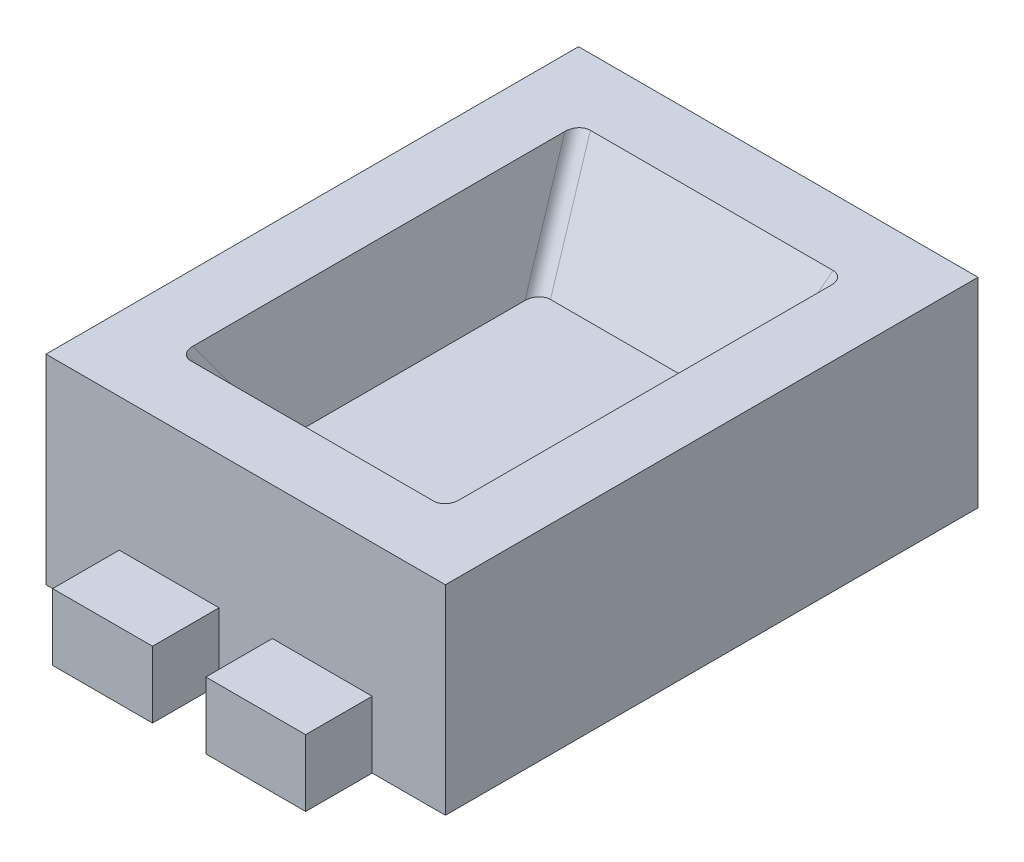
ISO-10303-21;
HEADER;
FILE_DESCRIPTION(('STEP AP214'),'2;1');
FILE_NAME('part.step','',(''),(''),'','','');
FILE_SCHEMA(('AUTOMOTIVE_DESIGN { 1 0 10303 214 1 1 1 1 }'));
ENDSEC;
DATA;
#1=APPLICATION_CONTEXT('core data for automotive mechanical design processes');
#2=APPLICATION_PROTOCOL_DEFINITION('international standard','automotive_design',2000,#1);
#3=PRODUCT_CONTEXT('',#1,'mechanical');
#4=PRODUCT('Part','Part','',(#3));
#5=PRODUCT_RELATED_PRODUCT_CATEGORY('part','',(#4));
#6=PRODUCT_DEFINITION_FORMATION('','',#4);
#7=PRODUCT_DEFINITION_CONTEXT('part definition',#1,'design');
#8=PRODUCT_DEFINITION('design','',#6,#7);
#9=PRODUCT_DEFINITION_SHAPE('','',#8);
#10=(LENGTH_UNIT() NAMED_UNIT(*) SI_UNIT(.MILLI.,.METRE.));
#11=(NAMED_UNIT(*) PLANE_ANGLE_UNIT() SI_UNIT($,.RADIAN.));
#12=(NAMED_UNIT(*) SI_UNIT($,.STERADIAN.) SOLID_ANGLE_UNIT());
#13=UNCERTAINTY_MEASURE_WITH_UNIT(LENGTH_MEASURE(1.E-05),#10,'distance_accuracy_value','');
#14=(GEOMETRIC_REPRESENTATION_CONTEXT(3) GLOBAL_UNCERTAINTY_ASSIGNED_CONTEXT((#13)) GLOBAL_UNIT_ASSIGNED_CONTEXT((#10,
#11,#12)) REPRESENTATION_CONTEXT('',''));
#15=CARTESIAN_POINT('',(0.,0.,0.));
#16=DIRECTION('',(0.,0.,1.));
#17=DIRECTION('',(1.,0.,0.));
#18=AXIS2_PLACEMENT_3D('',#15,#16,#17);
#19=CARTESIAN_POINT('',(1.5,0.,2.));
#20=DIRECTION('',(0.,0.,-1.));
#21=DIRECTION('',(-1.,0.,0.));
#22=AXIS2_PLACEMENT_3D('',#19,#20,#21);
#23=PLANE('',#22);
#24=DIRECTION('',(0.,-1.,0.));
#25=VECTOR('',#24,1.);
#26=CARTESIAN_POINT('',(0.2,0.,2.));
#27=LINE('',#26,#25);
#28=CARTESIAN_POINT('',(0.2,0.5,2.));
#29=VERTEX_POINT('',#28);
#30=CARTESIAN_POINT('',(0.2,0.,2.));
#31=VERTEX_POINT('',#30);
#32=EDGE_CURVE('E347',#29,#31,#27,.T.);
#33=ORIENTED_EDGE('',*,*,#32,.F.);
#34=DIRECTION('',(-1.,0.,0.));
#35=VECTOR('',#34,1.);
#36=CARTESIAN_POINT('',(0.2,0.5,2.));
#37=LINE('',#36,#35);
#38=CARTESIAN_POINT('',(0.95,0.5,2.));
#39=VERTEX_POINT('',#38);
#40=EDGE_CURVE('E340',#39,#29,#37,.T.);
#41=ORIENTED_EDGE('',*,*,#40,.F.);
#42=DIRECTION('',(0.,1.,0.));
#43=VECTOR('',#42,1.);
#44=CARTESIAN_POINT('',(0.95,0.,2.));
#45=LINE('',#44,#43);
#46=CARTESIAN_POINT('',(0.95,0.,2.));
#47=VERTEX_POINT('',#46);
#48=EDGE_CURVE('E343',#47,#39,#45,.T.);
#49=ORIENTED_EDGE('',*,*,#48,.F.);
#50=DIRECTION('',(-1.,0.,0.));
#51=VECTOR('',#50,1.);
#52=CARTESIAN_POINT('',(1.5,0.,2.));
#53=LINE('',#52,#51);
#54=CARTESIAN_POINT('',(1.5,0.,2.));
#55=VERTEX_POINT('',#54);
#56=EDGE_CURVE('E411',#55,#47,#53,.T.);
#57=ORIENTED_EDGE('',*,*,#56,.F.);
#58=DIRECTION('',(0.,-1.,0.));
#59=VECTOR('',#58,1.);
#60=CARTESIAN_POINT('',(1.5,0.,2.));
#61=LINE('',#60,#59);
#62=CARTESIAN_POINT('',(1.5,1.5,2.));
#63=VERTEX_POINT('',#62);
#64=EDGE_CURVE('E420',#63,#55,#61,.T.);
#65=ORIENTED_EDGE('',*,*,#64,.F.);
#66=DIRECTION('',(-1.,0.,0.));
#67=VECTOR('',#66,1.);
#68=CARTESIAN_POINT('',(1.5,1.5,2.));
#69=LINE('',#68,#67);
#70=CARTESIAN_POINT('',(-1.5,1.5,2.));
#71=VERTEX_POINT('',#70);
#72=EDGE_CURVE('E406',#63,#71,#69,.T.);
#73=ORIENTED_EDGE('',*,*,#72,.T.);
#74=DIRECTION('',(0.,-1.,0.));
#75=VECTOR('',#74,1.);
#76=CARTESIAN_POINT('',(-1.5,0.,2.));
#77=LINE('',#76,#75);
#78=CARTESIAN_POINT('',(-1.5,0.,2.));
#79=VERTEX_POINT('',#78);
#80=EDGE_CURVE('E421',#71,#79,#77,.T.);
#81=ORIENTED_EDGE('',*,*,#80,.T.);
#82=CARTESIAN_POINT('',(-0.95,0.,2.));
#83=VERTEX_POINT('',#82);
#84=EDGE_CURVE('E410',#83,#79,#53,.T.);
#85=ORIENTED_EDGE('',*,*,#84,.F.);
#86=DIRECTION('',(0.,-1.,0.));
#87=VECTOR('',#86,1.);
#88=CARTESIAN_POINT('',(-0.95,0.,2.));
#89=LINE('',#88,#87);
#90=CARTESIAN_POINT('',(-0.95,0.5,2.));
#91=VERTEX_POINT('',#90);
#92=EDGE_CURVE('E350',#91,#83,#89,.T.);
#93=ORIENTED_EDGE('',*,*,#92,.F.);
#94=DIRECTION('',(-1.,0.,0.));
#95=VECTOR('',#94,1.);
#96=CARTESIAN_POINT('',(-0.95,0.5,2.));
#97=LINE('',#96,#95);
#98=CARTESIAN_POINT('',(-0.2,0.5,2.));
#99=VERTEX_POINT('',#98);
#100=EDGE_CURVE('E367',#99,#91,#97,.T.);
#101=ORIENTED_EDGE('',*,*,#100,.F.);
#102=DIRECTION('',(0.,1.,0.));
#103=VECTOR('',#102,1.);
#104=CARTESIAN_POINT('',(-0.2,0.,2.));
#105=LINE('',#104,#103);
#106=CARTESIAN_POINT('',(-0.2,0.,2.));
#107=VERTEX_POINT('',#106);
#108=EDGE_CURVE('E380',#107,#99,#105,.T.);
#109=ORIENTED_EDGE('',*,*,#108,.F.);
#110=EDGE_CURVE('E416',#31,#107,#53,.T.);
#111=ORIENTED_EDGE('',*,*,#110,.F.);
#112=EDGE_LOOP('',(#33,#41,#49,#57,#65,#73,#81,#85,#93,#101,#109,#111));
#113=FACE_BOUND('',#112,.T.);
#114=ADVANCED_FACE('F51',(#113),#23,.F.);
#115=CARTESIAN_POINT('',(1.,1.5,1.5));
#116=DIRECTION('',(0.966234939601246,-0.257662650560332,0.));
#117=DIRECTION('',(0.257662650560332,0.966234939601246,0.));
#118=AXIS2_PLACEMENT_3D('',#115,#116,#117);
#119=PLANE('',#118);
#120=DIRECTION('',(0.,0.,-1.));
#121=VECTOR('',#120,1.);
#122=CARTESIAN_POINT('',(0.8,0.75,1.5));
#123=LINE('',#122,#121);
#124=CARTESIAN_POINT('',(0.8,0.75,0.896992467521889));
#125=VERTEX_POINT('',#124);
#126=CARTESIAN_POINT('',(0.8,0.75,-0.896992467521889));
#127=VERTEX_POINT('',#126);
#128=EDGE_CURVE('E461',#125,#127,#123,.T.);
#129=ORIENTED_EDGE('',*,*,#128,.F.);
#130=DIRECTION('',(-0.216612144429553,-0.812295541610823,-0.541530361073883));
#131=VECTOR('',#130,1.);
#132=CARTESIAN_POINT('',(1.0120829950121,1.54531123129536,1.42719995505213));
#133=LINE('',#132,#131);
#134=CARTESIAN_POINT('',(1.,1.5,1.39699246752189));
#135=VERTEX_POINT('',#134);
#136=EDGE_CURVE('E505',#125,#135,#133,.F.);
#137=ORIENTED_EDGE('',*,*,#136,.T.);
#138=DIRECTION('',(0.,0.,-1.));
#139=VECTOR('',#138,1.);
#140=CARTESIAN_POINT('',(1.,1.5,1.5));
#141=LINE('',#140,#139);
#142=CARTESIAN_POINT('',(1.,1.5,-1.39699246752189));
#143=VERTEX_POINT('',#142);
#144=EDGE_CURVE('E465',#135,#143,#141,.T.);
#145=ORIENTED_EDGE('',*,*,#144,.T.);
#146=DIRECTION('',(0.216612144429553,0.812295541610823,-0.541530361073883));
#147=VECTOR('',#146,1.);
#148=CARTESIAN_POINT('',(0.812082995012095,0.795311231295357,-0.927199955052127));
#149=LINE('',#148,#147);
#150=EDGE_CURVE('E502',#143,#127,#149,.F.);
#151=ORIENTED_EDGE('',*,*,#150,.T.);
#152=EDGE_LOOP('',(#129,#137,#145,#151));
#153=FACE_BOUND('',#152,.T.);
#154=ADVANCED_FACE('F563',(#153),#119,.F.);
#155=CARTESIAN_POINT('',(0.8,0.75,1.5));
#156=DIRECTION('',(0.,-1.,0.));
#157=DIRECTION('',(0.,0.,-1.));
#158=AXIS2_PLACEMENT_3D('',#155,#156,#157);
#159=PLANE('',#158);
#160=DIRECTION('',(-1.,0.,0.));
#161=VECTOR('',#160,1.);
#162=CARTESIAN_POINT('',(1.5,0.75,1.));
#163=LINE('',#162,#161);
#164=CARTESIAN_POINT('',(0.711297507257606,0.75,1.));
#165=VERTEX_POINT('',#164);
#166=CARTESIAN_POINT('',(-0.711297507257606,0.75,1.));
#167=VERTEX_POINT('',#166);
#168=EDGE_CURVE('E415',#165,#167,#163,.T.);
#169=ORIENTED_EDGE('',*,*,#168,.F.);
#170=CARTESIAN_POINT('',(0.696505502024933,0.75,0.879814957484533));
#171=DIRECTION('',(0.,-1.,0.));
#172=DIRECTION('',(0.371390676354103,0.,0.92847669088526));
#173=AXIS2_PLACEMENT_3D('',#170,#171,#172);
#174=ELLIPSE('',#173,0.123107902084129,0.1);
#175=EDGE_CURVE('E499',#165,#125,#174,.F.);
#176=ORIENTED_EDGE('',*,*,#175,.T.);
#177=ORIENTED_EDGE('',*,*,#128,.T.);
#178=CARTESIAN_POINT('',(0.696505502024933,0.75,-0.879814957484533));
#179=DIRECTION('',(0.,-1.,0.));
#180=DIRECTION('',(-0.371390676354103,0.,0.92847669088526));
#181=AXIS2_PLACEMENT_3D('',#178,#179,#180);
#182=ELLIPSE('',#181,0.123107902084129,0.1);
#183=CARTESIAN_POINT('',(0.711297507257606,0.75,-1.));
#184=VERTEX_POINT('',#183);
#185=EDGE_CURVE('E496',#127,#184,#182,.F.);
#186=ORIENTED_EDGE('',*,*,#185,.T.);
#187=DIRECTION('',(-1.,0.,0.));
#188=VECTOR('',#187,1.);
#189=CARTESIAN_POINT('',(1.5,0.75,-1.));
#190=LINE('',#189,#188);
#191=CARTESIAN_POINT('',(-0.711297507257606,0.75,-1.));
#192=VERTEX_POINT('',#191);
#193=EDGE_CURVE('E433',#184,#192,#190,.T.);
#194=ORIENTED_EDGE('',*,*,#193,.T.);
#195=CARTESIAN_POINT('',(-0.696505502024933,0.75,-0.879814957484533));
#196=DIRECTION('',(0.,-1.,0.));
#197=DIRECTION('',(-0.371390676354103,0.,-0.92847669088526));
#198=AXIS2_PLACEMENT_3D('',#195,#196,#197);
#199=ELLIPSE('',#198,0.123107902084129,0.1);
#200=CARTESIAN_POINT('',(-0.8,0.75,-0.896992467521889));
#201=VERTEX_POINT('',#200);
#202=EDGE_CURVE('E493',#192,#201,#199,.F.);
#203=ORIENTED_EDGE('',*,*,#202,.T.);
#204=DIRECTION('',(0.,0.,-1.));
#205=VECTOR('',#204,1.);
#206=CARTESIAN_POINT('',(-0.8,0.75,1.5));
#207=LINE('',#206,#205);
#208=CARTESIAN_POINT('',(-0.8,0.75,0.896992467521889));
#209=VERTEX_POINT('',#208);
#210=EDGE_CURVE('E457',#209,#201,#207,.T.);
#211=ORIENTED_EDGE('',*,*,#210,.F.);
#212=CARTESIAN_POINT('',(-0.696505502024933,0.75,0.879814957484533));
#213=DIRECTION('',(0.,-1.,0.));
#214=DIRECTION('',(0.371390676354103,0.,-0.92847669088526));
#215=AXIS2_PLACEMENT_3D('',#212,#213,#214);
#216=ELLIPSE('',#215,0.123107902084129,0.1);
#217=EDGE_CURVE('E490',#209,#167,#216,.F.);
#218=ORIENTED_EDGE('',*,*,#217,.T.);
#219=EDGE_LOOP('',(#169,#176,#177,#186,#194,#203,#211,#218));
#220=FACE_BOUND('',#219,.T.);
#221=ADVANCED_FACE('F545',(#220),#159,.F.);
#222=CARTESIAN_POINT('',(-1.,1.5,1.5));
#223=DIRECTION('',(-0.966234939601246,-0.257662650560332,0.));
#224=DIRECTION('',(0.257662650560332,-0.966234939601246,0.));
#225=AXIS2_PLACEMENT_3D('',#222,#223,#224);
#226=PLANE('',#225);
#227=ORIENTED_EDGE('',*,*,#210,.T.);
#228=DIRECTION('',(0.216612144429553,-0.812295541610823,0.541530361073883));
#229=VECTOR('',#228,1.);
#230=CARTESIAN_POINT('',(-1.0120829950121,1.54531123129536,-1.42719995505213));
#231=LINE('',#230,#229);
#232=CARTESIAN_POINT('',(-1.,1.5,-1.39699246752189));
#233=VERTEX_POINT('',#232);
#234=EDGE_CURVE('E519',#201,#233,#231,.F.);
#235=ORIENTED_EDGE('',*,*,#234,.T.);
#236=DIRECTION('',(0.,0.,-1.));
#237=VECTOR('',#236,1.);
#238=CARTESIAN_POINT('',(-1.,1.5,1.5));
#239=LINE('',#238,#237);
#240=CARTESIAN_POINT('',(-1.,1.5,1.39699246752189));
#241=VERTEX_POINT('',#240);
#242=EDGE_CURVE('E452',#241,#233,#239,.T.);
#243=ORIENTED_EDGE('',*,*,#242,.F.);
#244=DIRECTION('',(-0.216612144429553,0.812295541610823,0.541530361073883));
#245=VECTOR('',#244,1.);
#246=CARTESIAN_POINT('',(-0.812082995012095,0.795311231295357,0.927199955052127));
#247=LINE('',#246,#245);
#248=EDGE_CURVE('E516',#241,#209,#247,.F.);
#249=ORIENTED_EDGE('',*,*,#248,.T.);
#250=EDGE_LOOP('',(#227,#235,#243,#249));
#251=FACE_BOUND('',#250,.T.);
#252=ADVANCED_FACE('F548',(#251),#226,.F.);
#253=CARTESIAN_POINT('',(-1.5,0.,1.5));
#254=DIRECTION('',(1.,0.,0.));
#255=DIRECTION('',(0.,0.,-1.));
#256=AXIS2_PLACEMENT_3D('',#253,#254,#255);
#257=PLANE('',#256);
#258=DIRECTION('',(0.,0.,-1.));
#259=VECTOR('',#258,1.);
#260=CARTESIAN_POINT('',(-1.5,0.,1.5));
#261=LINE('',#260,#259);
#262=CARTESIAN_POINT('',(-1.5,0.,-2.));
#263=VERTEX_POINT('',#262);
#264=EDGE_CURVE('E475',#79,#263,#261,.T.);
#265=ORIENTED_EDGE('',*,*,#264,.F.);
#266=ORIENTED_EDGE('',*,*,#80,.F.);
#267=DIRECTION('',(0.,0.,-1.));
#268=VECTOR('',#267,1.);
#269=CARTESIAN_POINT('',(-1.5,1.5,1.5));
#270=LINE('',#269,#268);
#271=CARTESIAN_POINT('',(-1.5,1.5,-2.));
#272=VERTEX_POINT('',#271);
#273=EDGE_CURVE('E479',#71,#272,#270,.T.);
#274=ORIENTED_EDGE('',*,*,#273,.T.);
#275=DIRECTION('',(0.,1.,0.));
#276=VECTOR('',#275,1.);
#277=CARTESIAN_POINT('',(-1.5,0.,-2.));
#278=LINE('',#277,#276);
#279=EDGE_CURVE('E425',#263,#272,#278,.T.);
#280=ORIENTED_EDGE('',*,*,#279,.F.);
#281=EDGE_LOOP('',(#265,#266,#274,#280));
#282=FACE_BOUND('',#281,.T.);
#283=ADVANCED_FACE('F592',(#282),#257,.F.);
#284=CARTESIAN_POINT('',(-1.5,0.,1.5));
#285=DIRECTION('',(0.,1.,0.));
#286=DIRECTION('',(0.,0.,1.));
#287=AXIS2_PLACEMENT_3D('',#284,#285,#286);
#288=PLANE('',#287);
#289=ORIENTED_EDGE('',*,*,#264,.T.);
#290=DIRECTION('',(-1.,0.,0.));
#291=VECTOR('',#290,1.);
#292=CARTESIAN_POINT('',(1.5,0.,-2.));
#293=LINE('',#292,#291);
#294=CARTESIAN_POINT('',(-0.95,0.,-2.));
#295=VERTEX_POINT('',#294);
#296=EDGE_CURVE('E448',#295,#263,#293,.T.);
#297=ORIENTED_EDGE('',*,*,#296,.F.);
#298=DIRECTION('',(0.,0.,1.));
#299=VECTOR('',#298,1.);
#300=CARTESIAN_POINT('',(-0.95,0.,-2.5));
#301=LINE('',#300,#299);
#302=CARTESIAN_POINT('',(-0.95,0.,-2.5));
#303=VERTEX_POINT('',#302);
#304=EDGE_CURVE('E300',#303,#295,#301,.T.);
#305=ORIENTED_EDGE('',*,*,#304,.F.);
#306=DIRECTION('',(1.,0.,0.));
#307=VECTOR('',#306,1.);
#308=CARTESIAN_POINT('',(-0.95,0.,-2.5));
#309=LINE('',#308,#307);
#310=CARTESIAN_POINT('',(-0.2,0.,-2.5));
#311=VERTEX_POINT('',#310);
#312=EDGE_CURVE('E296',#303,#311,#309,.T.);
#313=ORIENTED_EDGE('',*,*,#312,.T.);
#314=DIRECTION('',(0.,0.,1.));
#315=VECTOR('',#314,1.);
#316=CARTESIAN_POINT('',(-0.2,0.,-2.5));
#317=LINE('',#316,#315);
#318=CARTESIAN_POINT('',(-0.2,0.,-2.));
#319=VERTEX_POINT('',#318);
#320=EDGE_CURVE('E313',#311,#319,#317,.T.);
#321=ORIENTED_EDGE('',*,*,#320,.T.);
#322=CARTESIAN_POINT('',(0.2,0.,-2.));
#323=VERTEX_POINT('',#322);
#324=EDGE_CURVE('E453',#323,#319,#293,.T.);
#325=ORIENTED_EDGE('',*,*,#324,.F.);
#326=DIRECTION('',(0.,0.,1.));
#327=VECTOR('',#326,1.);
#328=CARTESIAN_POINT('',(0.2,0.,-2.5));
#329=LINE('',#328,#327);
#330=CARTESIAN_POINT('',(0.2,0.,-2.5));
#331=VERTEX_POINT('',#330);
#332=EDGE_CURVE('E268',#331,#323,#329,.T.);
#333=ORIENTED_EDGE('',*,*,#332,.F.);
#334=DIRECTION('',(1.,0.,0.));
#335=VECTOR('',#334,1.);
#336=CARTESIAN_POINT('',(0.2,0.,-2.5));
#337=LINE('',#336,#335);
#338=CARTESIAN_POINT('',(0.95,0.,-2.5));
#339=VERTEX_POINT('',#338);
#340=EDGE_CURVE('E256',#331,#339,#337,.T.);
#341=ORIENTED_EDGE('',*,*,#340,.T.);
#342=DIRECTION('',(0.,0.,1.));
#343=VECTOR('',#342,1.);
#344=CARTESIAN_POINT('',(0.95,0.,-2.5));
#345=LINE('',#344,#343);
#346=CARTESIAN_POINT('',(0.95,0.,-2.));
#347=VERTEX_POINT('',#346);
#348=EDGE_CURVE('E277',#339,#347,#345,.T.);
#349=ORIENTED_EDGE('',*,*,#348,.T.);
#350=CARTESIAN_POINT('',(1.5,0.,-2.));
#351=VERTEX_POINT('',#350);
#352=EDGE_CURVE('E449',#351,#347,#293,.T.);
#353=ORIENTED_EDGE('',*,*,#352,.F.);
#354=DIRECTION('',(0.,0.,-1.));
#355=VECTOR('',#354,1.);
#356=CARTESIAN_POINT('',(1.5,0.,1.5));
#357=LINE('',#356,#355);
#358=EDGE_CURVE('E472',#55,#351,#357,.T.);
#359=ORIENTED_EDGE('',*,*,#358,.F.);
#360=ORIENTED_EDGE('',*,*,#56,.T.);
#361=DIRECTION('',(0.,0.,-1.));
#362=VECTOR('',#361,1.);
#363=CARTESIAN_POINT('',(0.95,0.,2.5));
#364=LINE('',#363,#362);
#365=CARTESIAN_POINT('',(0.95,0.,2.5));
#366=VERTEX_POINT('',#365);
#367=EDGE_CURVE('E328',#366,#47,#364,.T.);
#368=ORIENTED_EDGE('',*,*,#367,.F.);
#369=DIRECTION('',(1.,0.,0.));
#370=VECTOR('',#369,1.);
#371=CARTESIAN_POINT('',(0.2,0.,2.5));
#372=LINE('',#371,#370);
#373=CARTESIAN_POINT('',(0.2,0.,2.5));
#374=VERTEX_POINT('',#373);
#375=EDGE_CURVE('E356',#374,#366,#372,.T.);
#376=ORIENTED_EDGE('',*,*,#375,.F.);
#377=DIRECTION('',(0.,0.,-1.));
#378=VECTOR('',#377,1.);
#379=CARTESIAN_POINT('',(0.2,0.,2.5));
#380=LINE('',#379,#378);
#381=EDGE_CURVE('E324',#374,#31,#380,.T.);
#382=ORIENTED_EDGE('',*,*,#381,.T.);
#383=ORIENTED_EDGE('',*,*,#110,.T.);
#384=DIRECTION('',(0.,0.,-1.));
#385=VECTOR('',#384,1.);
#386=CARTESIAN_POINT('',(-0.2,0.,2.5));
#387=LINE('',#386,#385);
#388=CARTESIAN_POINT('',(-0.2,0.,2.5));
#389=VERTEX_POINT('',#388);
#390=EDGE_CURVE('E394',#389,#107,#387,.T.);
#391=ORIENTED_EDGE('',*,*,#390,.F.);
#392=DIRECTION('',(1.,0.,0.));
#393=VECTOR('',#392,1.);
#394=CARTESIAN_POINT('',(-0.95,0.,2.5));
#395=LINE('',#394,#393);
#396=CARTESIAN_POINT('',(-0.95,0.,2.5));
#397=VERTEX_POINT('',#396);
#398=EDGE_CURVE('E366',#397,#389,#395,.T.);
#399=ORIENTED_EDGE('',*,*,#398,.F.);
#400=DIRECTION('',(0.,0.,-1.));
#401=VECTOR('',#400,1.);
#402=CARTESIAN_POINT('',(-0.95,0.,2.5));
#403=LINE('',#402,#401);
#404=EDGE_CURVE('E398',#397,#83,#403,.T.);
#405=ORIENTED_EDGE('',*,*,#404,.T.);
#406=ORIENTED_EDGE('',*,*,#84,.T.);
#407=EDGE_LOOP('',(#289,#297,#305,#313,#321,#325,#333,#341,#349,#353,#359,#360,#368,#376,#382,
#383,#391,#399,#405,#406));
#408=FACE_BOUND('',#407,.T.);
#409=ADVANCED_FACE('F601',(#408),#288,.F.);
#410=CARTESIAN_POINT('',(1.5,0.,1.5));
#411=DIRECTION('',(-1.,0.,0.));
#412=DIRECTION('',(0.,0.,1.));
#413=AXIS2_PLACEMENT_3D('',#410,#411,#412);
#414=PLANE('',#413);
#415=DIRECTION('',(0.,0.,-1.));
#416=VECTOR('',#415,1.);
#417=CARTESIAN_POINT('',(1.5,1.5,1.5));
#418=LINE('',#417,#416);
#419=CARTESIAN_POINT('',(1.5,1.5,-2.));
#420=VERTEX_POINT('',#419);
#421=EDGE_CURVE('E469',#63,#420,#418,.T.);
#422=ORIENTED_EDGE('',*,*,#421,.F.);
#423=ORIENTED_EDGE('',*,*,#64,.T.);
#424=ORIENTED_EDGE('',*,*,#358,.T.);
#425=DIRECTION('',(0.,1.,0.));
#426=VECTOR('',#425,1.);
#427=CARTESIAN_POINT('',(1.5,0.,-2.));
#428=LINE('',#427,#426);
#429=EDGE_CURVE('E429',#351,#420,#428,.T.);
#430=ORIENTED_EDGE('',*,*,#429,.T.);
#431=EDGE_LOOP('',(#422,#423,#424,#430));
#432=FACE_BOUND('',#431,.T.);
#433=ADVANCED_FACE('F597',(#432),#414,.F.);
#434=CARTESIAN_POINT('',(1.5,1.5,1.5));
#435=DIRECTION('',(0.,-1.,0.));
#436=DIRECTION('',(0.,0.,-1.));
#437=AXIS2_PLACEMENT_3D('',#434,#435,#436);
#438=PLANE('',#437);
#439=ORIENTED_EDGE('',*,*,#273,.F.);
#440=ORIENTED_EDGE('',*,*,#72,.F.);
#441=ORIENTED_EDGE('',*,*,#421,.T.);
#442=DIRECTION('',(-1.,0.,0.));
#443=VECTOR('',#442,1.);
#444=CARTESIAN_POINT('',(1.5,1.5,-2.));
#445=LINE('',#444,#443);
#446=EDGE_CURVE('E444',#420,#272,#445,.T.);
#447=ORIENTED_EDGE('',*,*,#446,.T.);
#448=EDGE_LOOP('',(#439,#440,#441,#447));
#449=FACE_BOUND('',#448,.T.);
#450=ORIENTED_EDGE('',*,*,#144,.F.);
#451=CARTESIAN_POINT('',(0.896505502024933,1.5,1.37981495748453));
#452=DIRECTION('',(0.,-1.,0.));
#453=DIRECTION('',(0.371390676354103,0.,0.92847669088526));
#454=AXIS2_PLACEMENT_3D('',#451,#452,#453);
#455=ELLIPSE('',#454,0.123107902084129,0.1);
#456=CARTESIAN_POINT('',(0.911297507257606,1.5,1.5));
#457=VERTEX_POINT('',#456);
#458=EDGE_CURVE('E522',#135,#457,#455,.T.);
#459=ORIENTED_EDGE('',*,*,#458,.T.);
#460=DIRECTION('',(-1.,0.,0.));
#461=VECTOR('',#460,1.);
#462=CARTESIAN_POINT('',(1.5,1.5,1.5));
#463=LINE('',#462,#461);
#464=CARTESIAN_POINT('',(-0.911297507257606,1.5,1.5));
#465=VERTEX_POINT('',#464);
#466=EDGE_CURVE('E402',#457,#465,#463,.T.);
#467=ORIENTED_EDGE('',*,*,#466,.T.);
#468=CARTESIAN_POINT('',(-0.896505502024933,1.5,1.37981495748453));
#469=DIRECTION('',(0.,-1.,0.));
#470=DIRECTION('',(0.371390676354103,0.,-0.92847669088526));
#471=AXIS2_PLACEMENT_3D('',#468,#469,#470);
#472=ELLIPSE('',#471,0.123107902084129,0.1);
#473=EDGE_CURVE('E11',#465,#241,#472,.T.);
#474=ORIENTED_EDGE('',*,*,#473,.T.);
#475=ORIENTED_EDGE('',*,*,#242,.T.);
#476=CARTESIAN_POINT('',(-0.896505502024933,1.5,-1.37981495748453));
#477=DIRECTION('',(0.,-1.,0.));
#478=DIRECTION('',(-0.371390676354103,0.,-0.92847669088526));
#479=AXIS2_PLACEMENT_3D('',#476,#477,#478);
#480=ELLIPSE('',#479,0.123107902084129,0.1);
#481=CARTESIAN_POINT('',(-0.911297507257606,1.5,-1.5));
#482=VERTEX_POINT('',#481);
#483=EDGE_CURVE('E60',#233,#482,#480,.T.);
#484=ORIENTED_EDGE('',*,*,#483,.T.);
#485=DIRECTION('',(-1.,0.,0.));
#486=VECTOR('',#485,1.);
#487=CARTESIAN_POINT('',(1.5,1.5,-1.5));
#488=LINE('',#487,#486);
#489=CARTESIAN_POINT('',(0.911297507257606,1.5,-1.5));
#490=VERTEX_POINT('',#489);
#491=EDGE_CURVE('E440',#490,#482,#488,.T.);
#492=ORIENTED_EDGE('',*,*,#491,.F.);
#493=CARTESIAN_POINT('',(0.896505502024933,1.5,-1.37981495748453));
#494=DIRECTION('',(0.,-1.,0.));
#495=DIRECTION('',(-0.371390676354103,0.,0.92847669088526));
#496=AXIS2_PLACEMENT_3D('',#493,#494,#495);
#497=ELLIPSE('',#496,0.123107902084129,0.1);
#498=EDGE_CURVE('E525',#490,#143,#497,.T.);
#499=ORIENTED_EDGE('',*,*,#498,.T.);
#500=EDGE_LOOP('',(#450,#459,#467,#474,#475,#484,#492,#499));
#501=FACE_BOUND('',#500,.T.);
#502=ADVANCED_FACE('F532',(#449,#501),#438,.F.);
#503=CARTESIAN_POINT('',(1.5,1.5,-1.5));
#504=DIRECTION('',(0.,-0.554700196225229,-0.832050294337844));
#505=DIRECTION('',(0.,0.832050294337843,-0.554700196225229));
#506=AXIS2_PLACEMENT_3D('',#503,#504,#505);
#507=PLANE('',#506);
#508=ORIENTED_EDGE('',*,*,#193,.F.);
#509=DIRECTION('',(0.216612144429553,0.812295541610823,-0.541530361073883));
#510=VECTOR('',#509,1.);
#511=CARTESIAN_POINT('',(0.91545950105197,1.51560747672887,-1.51040498448591));
#512=LINE('',#511,#510);
#513=EDGE_CURVE('E512',#184,#490,#512,.T.);
#514=ORIENTED_EDGE('',*,*,#513,.T.);
#515=ORIENTED_EDGE('',*,*,#491,.T.);
#516=DIRECTION('',(0.216612144429553,-0.812295541610823,0.541530361073883));
#517=VECTOR('',#516,1.);
#518=CARTESIAN_POINT('',(-0.715459501051971,0.765607476728868,-1.01040498448591));
#519=LINE('',#518,#517);
#520=EDGE_CURVE('E508',#482,#192,#519,.T.);
#521=ORIENTED_EDGE('',*,*,#520,.T.);
#522=EDGE_LOOP('',(#508,#514,#515,#521));
#523=FACE_BOUND('',#522,.T.);
#524=ADVANCED_FACE('F539',(#523),#507,.F.);
#525=CARTESIAN_POINT('',(1.5,0.,-2.));
#526=DIRECTION('',(0.,0.,1.));
#527=DIRECTION('',(1.,0.,0.));
#528=AXIS2_PLACEMENT_3D('',#525,#526,#527);
#529=PLANE('',#528);
#530=DIRECTION('',(-1.,0.,0.));
#531=VECTOR('',#530,1.);
#532=CARTESIAN_POINT('',(0.2,0.5,-2.));
#533=LINE('',#532,#531);
#534=CARTESIAN_POINT('',(0.95,0.5,-2.));
#535=VERTEX_POINT('',#534);
#536=CARTESIAN_POINT('',(0.2,0.5,-2.));
#537=VERTEX_POINT('',#536);
#538=EDGE_CURVE('E67',#535,#537,#533,.T.);
#539=ORIENTED_EDGE('',*,*,#538,.T.);
#540=DIRECTION('',(0.,-1.,0.));
#541=VECTOR('',#540,1.);
#542=CARTESIAN_POINT('',(0.2,0.,-2.));
#543=LINE('',#542,#541);
#544=EDGE_CURVE('E242',#537,#323,#543,.T.);
#545=ORIENTED_EDGE('',*,*,#544,.T.);
#546=ORIENTED_EDGE('',*,*,#324,.T.);
#547=DIRECTION('',(0.,1.,0.));
#548=VECTOR('',#547,1.);
#549=CARTESIAN_POINT('',(-0.2,0.,-2.));
#550=LINE('',#549,#548);
#551=CARTESIAN_POINT('',(-0.2,0.5,-2.));
#552=VERTEX_POINT('',#551);
#553=EDGE_CURVE('E288',#319,#552,#550,.T.);
#554=ORIENTED_EDGE('',*,*,#553,.T.);
#555=DIRECTION('',(-1.,0.,0.));
#556=VECTOR('',#555,1.);
#557=CARTESIAN_POINT('',(-0.95,0.5,-2.));
#558=LINE('',#557,#556);
#559=CARTESIAN_POINT('',(-0.95,0.5,-2.));
#560=VERTEX_POINT('',#559);
#561=EDGE_CURVE('E304',#552,#560,#558,.T.);
#562=ORIENTED_EDGE('',*,*,#561,.T.);
#563=DIRECTION('',(0.,-1.,0.));
#564=VECTOR('',#563,1.);
#565=CARTESIAN_POINT('',(-0.95,0.,-2.));
#566=LINE('',#565,#564);
#567=EDGE_CURVE('E246',#560,#295,#566,.T.);
#568=ORIENTED_EDGE('',*,*,#567,.T.);
#569=ORIENTED_EDGE('',*,*,#296,.T.);
#570=ORIENTED_EDGE('',*,*,#279,.T.);
#571=ORIENTED_EDGE('',*,*,#446,.F.);
#572=ORIENTED_EDGE('',*,*,#429,.F.);
#573=ORIENTED_EDGE('',*,*,#352,.T.);
#574=DIRECTION('',(0.,1.,0.));
#575=VECTOR('',#574,1.);
#576=CARTESIAN_POINT('',(0.95,0.,-2.));
#577=LINE('',#576,#575);
#578=EDGE_CURVE('E72',#347,#535,#577,.T.);
#579=ORIENTED_EDGE('',*,*,#578,.T.);
#580=EDGE_LOOP('',(#539,#545,#546,#554,#562,#568,#569,#570,#571,#572,#573,#579));
#581=FACE_BOUND('',#580,.T.);
#582=ADVANCED_FACE('F587',(#581),#529,.F.);
#583=CARTESIAN_POINT('',(1.5,1.5,1.5));
#584=DIRECTION('',(0.,-0.554700196225229,0.832050294337844));
#585=DIRECTION('',(0.,-0.832050294337843,-0.554700196225229));
#586=AXIS2_PLACEMENT_3D('',#583,#584,#585);
#587=PLANE('',#586);
#588=ORIENTED_EDGE('',*,*,#466,.F.);
#589=DIRECTION('',(-0.216612144429553,-0.812295541610823,-0.541530361073883));
#590=VECTOR('',#589,1.);
#591=CARTESIAN_POINT('',(0.715459501051971,0.765607476728867,1.01040498448591));
#592=LINE('',#591,#590);
#593=EDGE_CURVE('E486',#457,#165,#592,.T.);
#594=ORIENTED_EDGE('',*,*,#593,.T.);
#595=ORIENTED_EDGE('',*,*,#168,.T.);
#596=DIRECTION('',(-0.216612144429553,0.812295541610823,0.541530361073883));
#597=VECTOR('',#596,1.);
#598=CARTESIAN_POINT('',(-0.91545950105197,1.51560747672887,1.51040498448591));
#599=LINE('',#598,#597);
#600=EDGE_CURVE('E482',#167,#465,#599,.T.);
#601=ORIENTED_EDGE('',*,*,#600,.T.);
#602=EDGE_LOOP('',(#588,#594,#595,#601));
#603=FACE_BOUND('',#602,.T.);
#604=ADVANCED_FACE('F554',(#603),#587,.F.);
#605=CARTESIAN_POINT('',(0.938919911609155,1.65905403594083,1.48585098144509));
#606=DIRECTION('',(0.216612144429553,0.812295541610823,0.541530361073883));
#607=DIRECTION('',(0.,-0.554700196225229,0.832050294337843));
#608=AXIS2_PLACEMENT_3D('',#605,#606,#607);
#609=CYLINDRICAL_SURFACE('',#608,0.1);
#610=ORIENTED_EDGE('',*,*,#458,.F.);
#611=ORIENTED_EDGE('',*,*,#136,.F.);
#612=ORIENTED_EDGE('',*,*,#175,.F.);
#613=ORIENTED_EDGE('',*,*,#593,.F.);
#614=EDGE_LOOP('',(#610,#611,#612,#613));
#615=FACE_BOUND('',#614,.T.);
#616=ADVANCED_FACE('F558',(#615),#609,.F.);
#617=CARTESIAN_POINT('',(0.938919911609155,1.65905403594083,-1.48585098144509));
#618=DIRECTION('',(-0.216612144429553,-0.812295541610823,0.541530361073883));
#619=DIRECTION('',(0.,-0.554700196225229,-0.832050294337843));
#620=AXIS2_PLACEMENT_3D('',#617,#618,#619);
#621=CYLINDRICAL_SURFACE('',#620,0.1);
#622=ORIENTED_EDGE('',*,*,#185,.F.);
#623=ORIENTED_EDGE('',*,*,#150,.F.);
#624=ORIENTED_EDGE('',*,*,#498,.F.);
#625=ORIENTED_EDGE('',*,*,#513,.F.);
#626=EDGE_LOOP('',(#622,#623,#624,#625));
#627=FACE_BOUND('',#626,.T.);
#628=ADVANCED_FACE('F566',(#627),#621,.F.);
#629=CARTESIAN_POINT('',(-0.798157448266047,1.13119479840418,-1.13394482308732));
#630=DIRECTION('',(-0.216612144429553,0.812295541610823,-0.541530361073883));
#631=DIRECTION('',(0.,0.554700196225229,0.832050294337843));
#632=AXIS2_PLACEMENT_3D('',#629,#630,#631);
#633=CYLINDRICAL_SURFACE('',#632,0.1);
#634=ORIENTED_EDGE('',*,*,#483,.F.);
#635=ORIENTED_EDGE('',*,*,#234,.F.);
#636=ORIENTED_EDGE('',*,*,#202,.F.);
#637=ORIENTED_EDGE('',*,*,#520,.F.);
#638=EDGE_LOOP('',(#634,#635,#636,#637));
#639=FACE_BOUND('',#638,.T.);
#640=ADVANCED_FACE('F541',(#639),#633,.F.);
#641=CARTESIAN_POINT('',(-0.798157448266047,1.13119479840418,1.13394482308732));
#642=DIRECTION('',(0.216612144429553,-0.812295541610823,-0.541530361073883));
#643=DIRECTION('',(0.,0.554700196225229,-0.832050294337843));
#644=AXIS2_PLACEMENT_3D('',#641,#642,#643);
#645=CYLINDRICAL_SURFACE('',#644,0.1);
#646=ORIENTED_EDGE('',*,*,#217,.F.);
#647=ORIENTED_EDGE('',*,*,#248,.F.);
#648=ORIENTED_EDGE('',*,*,#473,.F.);
#649=ORIENTED_EDGE('',*,*,#600,.F.);
#650=EDGE_LOOP('',(#646,#647,#648,#649));
#651=FACE_BOUND('',#650,.T.);
#652=ADVANCED_FACE('F53',(#651),#645,.F.);
#653=CARTESIAN_POINT('',(-0.95,0.,2.5));
#654=DIRECTION('',(1.,0.,0.));
#655=DIRECTION('',(0.,0.,-1.));
#656=AXIS2_PLACEMENT_3D('',#653,#654,#655);
#657=PLANE('',#656);
#658=ORIENTED_EDGE('',*,*,#92,.T.);
#659=ORIENTED_EDGE('',*,*,#404,.F.);
#660=DIRECTION('',(0.,-1.,0.));
#661=VECTOR('',#660,1.);
#662=CARTESIAN_POINT('',(-0.95,0.,2.5));
#663=LINE('',#662,#661);
#664=CARTESIAN_POINT('',(-0.95,0.5,2.5));
#665=VERTEX_POINT('',#664);
#666=EDGE_CURVE('E362',#665,#397,#663,.T.);
#667=ORIENTED_EDGE('',*,*,#666,.F.);
#668=DIRECTION('',(0.,0.,-1.));
#669=VECTOR('',#668,1.);
#670=CARTESIAN_POINT('',(-0.95,0.5,2.5));
#671=LINE('',#670,#669);
#672=EDGE_CURVE('E376',#665,#91,#671,.T.);
#673=ORIENTED_EDGE('',*,*,#672,.T.);
#674=EDGE_LOOP('',(#658,#659,#667,#673));
#675=FACE_BOUND('',#674,.T.);
#676=ADVANCED_FACE('F676',(#675),#657,.F.);
#677=CARTESIAN_POINT('',(-0.2,0.,2.5));
#678=DIRECTION('',(-1.,0.,0.));
#679=DIRECTION('',(0.,0.,1.));
#680=AXIS2_PLACEMENT_3D('',#677,#678,#679);
#681=PLANE('',#680);
#682=ORIENTED_EDGE('',*,*,#108,.T.);
#683=DIRECTION('',(0.,0.,-1.));
#684=VECTOR('',#683,1.);
#685=CARTESIAN_POINT('',(-0.2,0.5,2.5));
#686=LINE('',#685,#684);
#687=CARTESIAN_POINT('',(-0.2,0.5,2.5));
#688=VERTEX_POINT('',#687);
#689=EDGE_CURVE('E390',#688,#99,#686,.T.);
#690=ORIENTED_EDGE('',*,*,#689,.F.);
#691=DIRECTION('',(0.,1.,0.));
#692=VECTOR('',#691,1.);
#693=CARTESIAN_POINT('',(-0.2,0.,2.5));
#694=LINE('',#693,#692);
#695=EDGE_CURVE('E370',#389,#688,#694,.T.);
#696=ORIENTED_EDGE('',*,*,#695,.F.);
#697=ORIENTED_EDGE('',*,*,#390,.T.);
#698=EDGE_LOOP('',(#682,#690,#696,#697));
#699=FACE_BOUND('',#698,.T.);
#700=ADVANCED_FACE('F673',(#699),#681,.F.);
#701=CARTESIAN_POINT('',(-0.95,0.5,2.5));
#702=DIRECTION('',(0.,-1.,0.));
#703=DIRECTION('',(0.,0.,-1.));
#704=AXIS2_PLACEMENT_3D('',#701,#702,#703);
#705=PLANE('',#704);
#706=ORIENTED_EDGE('',*,*,#100,.T.);
#707=ORIENTED_EDGE('',*,*,#672,.F.);
#708=DIRECTION('',(-1.,0.,0.));
#709=VECTOR('',#708,1.);
#710=CARTESIAN_POINT('',(-0.95,0.5,2.5));
#711=LINE('',#710,#709);
#712=EDGE_CURVE('E373',#688,#665,#711,.T.);
#713=ORIENTED_EDGE('',*,*,#712,.F.);
#714=ORIENTED_EDGE('',*,*,#689,.T.);
#715=EDGE_LOOP('',(#706,#707,#713,#714));
#716=FACE_BOUND('',#715,.T.);
#717=ADVANCED_FACE('F669',(#716),#705,.F.);
#718=CARTESIAN_POINT('',(0.,0.,2.5));
#719=DIRECTION('',(0.,0.,-1.));
#720=DIRECTION('',(-1.,0.,0.));
#721=AXIS2_PLACEMENT_3D('',#718,#719,#720);
#722=PLANE('',#721);
#723=ORIENTED_EDGE('',*,*,#666,.T.);
#724=ORIENTED_EDGE('',*,*,#398,.T.);
#725=ORIENTED_EDGE('',*,*,#695,.T.);
#726=ORIENTED_EDGE('',*,*,#712,.T.);
#727=EDGE_LOOP('',(#723,#724,#725,#726));
#728=FACE_BOUND('',#727,.T.);
#729=ADVANCED_FACE('F655',(#728),#722,.F.);
#730=CARTESIAN_POINT('',(0.2,0.,2.5));
#731=DIRECTION('',(1.,0.,0.));
#732=DIRECTION('',(0.,1.,0.));
#733=AXIS2_PLACEMENT_3D('',#730,#731,#732);
#734=PLANE('',#733);
#735=ORIENTED_EDGE('',*,*,#32,.T.);
#736=ORIENTED_EDGE('',*,*,#381,.F.);
#737=DIRECTION('',(0.,-1.,0.));
#738=VECTOR('',#737,1.);
#739=CARTESIAN_POINT('',(0.2,0.,2.5));
#740=LINE('',#739,#738);
#741=CARTESIAN_POINT('',(0.2,0.5,2.5));
#742=VERTEX_POINT('',#741);
#743=EDGE_CURVE('E344',#742,#374,#740,.T.);
#744=ORIENTED_EDGE('',*,*,#743,.F.);
#745=DIRECTION('',(0.,0.,-1.));
#746=VECTOR('',#745,1.);
#747=CARTESIAN_POINT('',(0.2,0.5,2.5));
#748=LINE('',#747,#746);
#749=EDGE_CURVE('E335',#742,#29,#748,.T.);
#750=ORIENTED_EDGE('',*,*,#749,.T.);
#751=EDGE_LOOP('',(#735,#736,#744,#750));
#752=FACE_BOUND('',#751,.T.);
#753=ADVANCED_FACE('F651',(#752),#734,.F.);
#754=CARTESIAN_POINT('',(0.95,0.,2.5));
#755=DIRECTION('',(-1.,0.,0.));
#756=DIRECTION('',(0.,0.,1.));
#757=AXIS2_PLACEMENT_3D('',#754,#755,#756);
#758=PLANE('',#757);
#759=ORIENTED_EDGE('',*,*,#48,.T.);
#760=DIRECTION('',(0.,0.,-1.));
#761=VECTOR('',#760,1.);
#762=CARTESIAN_POINT('',(0.95,0.5,2.5));
#763=LINE('',#762,#761);
#764=CARTESIAN_POINT('',(0.95,0.5,2.5));
#765=VERTEX_POINT('',#764);
#766=EDGE_CURVE('E331',#765,#39,#763,.T.);
#767=ORIENTED_EDGE('',*,*,#766,.F.);
#768=DIRECTION('',(0.,1.,0.));
#769=VECTOR('',#768,1.);
#770=CARTESIAN_POINT('',(0.95,0.,2.5));
#771=LINE('',#770,#769);
#772=EDGE_CURVE('E353',#366,#765,#771,.T.);
#773=ORIENTED_EDGE('',*,*,#772,.F.);
#774=ORIENTED_EDGE('',*,*,#367,.T.);
#775=EDGE_LOOP('',(#759,#767,#773,#774));
#776=FACE_BOUND('',#775,.T.);
#777=ADVANCED_FACE('F654',(#776),#758,.F.);
#778=CARTESIAN_POINT('',(0.2,0.5,2.5));
#779=DIRECTION('',(0.,-1.,0.));
#780=DIRECTION('',(0.,0.,-1.));
#781=AXIS2_PLACEMENT_3D('',#778,#779,#780);
#782=PLANE('',#781);
#783=ORIENTED_EDGE('',*,*,#40,.T.);
#784=ORIENTED_EDGE('',*,*,#749,.F.);
#785=DIRECTION('',(-1.,0.,0.));
#786=VECTOR('',#785,1.);
#787=CARTESIAN_POINT('',(0.2,0.5,2.5));
#788=LINE('',#787,#786);
#789=EDGE_CURVE('E339',#765,#742,#788,.T.);
#790=ORIENTED_EDGE('',*,*,#789,.F.);
#791=ORIENTED_EDGE('',*,*,#766,.T.);
#792=EDGE_LOOP('',(#783,#784,#790,#791));
#793=FACE_BOUND('',#792,.T.);
#794=ADVANCED_FACE('F659',(#793),#782,.F.);
#795=CARTESIAN_POINT('',(0.,0.,2.5));
#796=DIRECTION('',(0.,0.,-1.));
#797=DIRECTION('',(-1.,0.,0.));
#798=AXIS2_PLACEMENT_3D('',#795,#796,#797);
#799=PLANE('',#798);
#800=ORIENTED_EDGE('',*,*,#743,.T.);
#801=ORIENTED_EDGE('',*,*,#375,.T.);
#802=ORIENTED_EDGE('',*,*,#772,.T.);
#803=ORIENTED_EDGE('',*,*,#789,.T.);
#804=EDGE_LOOP('',(#800,#801,#802,#803));
#805=FACE_BOUND('',#804,.T.);
#806=ADVANCED_FACE('F650',(#805),#799,.F.);
#807=CARTESIAN_POINT('',(-0.95,0.,-2.5));
#808=DIRECTION('',(-1.,0.,0.));
#809=DIRECTION('',(0.,0.,1.));
#810=AXIS2_PLACEMENT_3D('',#807,#808,#809);
#811=PLANE('',#810);
#812=ORIENTED_EDGE('',*,*,#567,.F.);
#813=DIRECTION('',(0.,0.,1.));
#814=VECTOR('',#813,1.);
#815=CARTESIAN_POINT('',(-0.95,0.5,-2.5));
#816=LINE('',#815,#814);
#817=CARTESIAN_POINT('',(-0.95,0.5,-2.5));
#818=VERTEX_POINT('',#817);
#819=EDGE_CURVE('E320',#818,#560,#816,.T.);
#820=ORIENTED_EDGE('',*,*,#819,.F.);
#821=DIRECTION('',(0.,-1.,0.));
#822=VECTOR('',#821,1.);
#823=CARTESIAN_POINT('',(-0.95,0.,-2.5));
#824=LINE('',#823,#822);
#825=EDGE_CURVE('E283',#818,#303,#824,.T.);
#826=ORIENTED_EDGE('',*,*,#825,.T.);
#827=ORIENTED_EDGE('',*,*,#304,.T.);
#828=EDGE_LOOP('',(#812,#820,#826,#827));
#829=FACE_BOUND('',#828,.T.);
#830=ADVANCED_FACE('F632',(#829),#811,.T.);
#831=CARTESIAN_POINT('',(-0.95,0.5,-2.5));
#832=DIRECTION('',(0.,1.,0.));
#833=DIRECTION('',(0.,0.,1.));
#834=AXIS2_PLACEMENT_3D('',#831,#832,#833);
#835=PLANE('',#834);
#836=ORIENTED_EDGE('',*,*,#561,.F.);
#837=DIRECTION('',(0.,0.,1.));
#838=VECTOR('',#837,1.);
#839=CARTESIAN_POINT('',(-0.2,0.5,-2.5));
#840=LINE('',#839,#838);
#841=CARTESIAN_POINT('',(-0.2,0.5,-2.5));
#842=VERTEX_POINT('',#841);
#843=EDGE_CURVE('E317',#842,#552,#840,.T.);
#844=ORIENTED_EDGE('',*,*,#843,.F.);
#845=DIRECTION('',(-1.,0.,0.));
#846=VECTOR('',#845,1.);
#847=CARTESIAN_POINT('',(-0.95,0.5,-2.5));
#848=LINE('',#847,#846);
#849=EDGE_CURVE('E287',#842,#818,#848,.T.);
#850=ORIENTED_EDGE('',*,*,#849,.T.);
#851=ORIENTED_EDGE('',*,*,#819,.T.);
#852=EDGE_LOOP('',(#836,#844,#850,#851));
#853=FACE_BOUND('',#852,.T.);
#854=ADVANCED_FACE('F629',(#853),#835,.T.);
#855=CARTESIAN_POINT('',(-0.2,0.,-2.5));
#856=DIRECTION('',(1.,0.,0.));
#857=DIRECTION('',(0.,0.,-1.));
#858=AXIS2_PLACEMENT_3D('',#855,#856,#857);
#859=PLANE('',#858);
#860=ORIENTED_EDGE('',*,*,#553,.F.);
#861=ORIENTED_EDGE('',*,*,#320,.F.);
#862=DIRECTION('',(0.,1.,0.));
#863=VECTOR('',#862,1.);
#864=CARTESIAN_POINT('',(-0.2,0.,-2.5));
#865=LINE('',#864,#863);
#866=EDGE_CURVE('E292',#311,#842,#865,.T.);
#867=ORIENTED_EDGE('',*,*,#866,.T.);
#868=ORIENTED_EDGE('',*,*,#843,.T.);
#869=EDGE_LOOP('',(#860,#861,#867,#868));
#870=FACE_BOUND('',#869,.T.);
#871=ADVANCED_FACE('F625',(#870),#859,.T.);
#872=CARTESIAN_POINT('',(0.,0.,-2.5));
#873=DIRECTION('',(0.,0.,1.));
#874=DIRECTION('',(-1.,0.,0.));
#875=AXIS2_PLACEMENT_3D('',#872,#873,#874);
#876=PLANE('',#875);
#877=ORIENTED_EDGE('',*,*,#825,.F.);
#878=ORIENTED_EDGE('',*,*,#849,.F.);
#879=ORIENTED_EDGE('',*,*,#866,.F.);
#880=ORIENTED_EDGE('',*,*,#312,.F.);
#881=EDGE_LOOP('',(#877,#878,#879,#880));
#882=FACE_BOUND('',#881,.T.);
#883=ADVANCED_FACE('F634',(#882),#876,.F.);
#884=CARTESIAN_POINT('',(0.2,0.,-2.5));
#885=DIRECTION('',(-1.,0.,0.));
#886=DIRECTION('',(0.,-1.,0.));
#887=AXIS2_PLACEMENT_3D('',#884,#885,#886);
#888=PLANE('',#887);
#889=ORIENTED_EDGE('',*,*,#544,.F.);
#890=DIRECTION('',(0.,0.,1.));
#891=VECTOR('',#890,1.);
#892=CARTESIAN_POINT('',(0.2,0.5,-2.5));
#893=LINE('',#892,#891);
#894=CARTESIAN_POINT('',(0.2,0.5,-2.5));
#895=VERTEX_POINT('',#894);
#896=EDGE_CURVE('E236',#895,#537,#893,.T.);
#897=ORIENTED_EDGE('',*,*,#896,.F.);
#898=DIRECTION('',(0.,-1.,0.));
#899=VECTOR('',#898,1.);
#900=CARTESIAN_POINT('',(0.2,0.,-2.5));
#901=LINE('',#900,#899);
#902=EDGE_CURVE('E240',#895,#331,#901,.T.);
#903=ORIENTED_EDGE('',*,*,#902,.T.);
#904=ORIENTED_EDGE('',*,*,#332,.T.);
#905=EDGE_LOOP('',(#889,#897,#903,#904));
#906=FACE_BOUND('',#905,.T.);
#907=ADVANCED_FACE('F238',(#906),#888,.T.);
#908=CARTESIAN_POINT('',(0.2,0.5,-2.5));
#909=DIRECTION('',(0.,1.,0.));
#910=DIRECTION('',(0.,0.,1.));
#911=AXIS2_PLACEMENT_3D('',#908,#909,#910);
#912=PLANE('',#911);
#913=ORIENTED_EDGE('',*,*,#538,.F.);
#914=DIRECTION('',(0.,0.,1.));
#915=VECTOR('',#914,1.);
#916=CARTESIAN_POINT('',(0.95,0.5,-2.5));
#917=LINE('',#916,#915);
#918=CARTESIAN_POINT('',(0.95,0.5,-2.5));
#919=VERTEX_POINT('',#918);
#920=EDGE_CURVE('E247',#919,#535,#917,.T.);
#921=ORIENTED_EDGE('',*,*,#920,.F.);
#922=DIRECTION('',(-1.,0.,0.));
#923=VECTOR('',#922,1.);
#924=CARTESIAN_POINT('',(0.2,0.5,-2.5));
#925=LINE('',#924,#923);
#926=EDGE_CURVE('E253',#919,#895,#925,.T.);
#927=ORIENTED_EDGE('',*,*,#926,.T.);
#928=ORIENTED_EDGE('',*,*,#896,.T.);
#929=EDGE_LOOP('',(#913,#921,#927,#928));
#930=FACE_BOUND('',#929,.T.);
#931=ADVANCED_FACE('F259',(#930),#912,.T.);
#932=CARTESIAN_POINT('',(0.95,0.,-2.5));
#933=DIRECTION('',(1.,0.,0.));
#934=DIRECTION('',(0.,0.,-1.));
#935=AXIS2_PLACEMENT_3D('',#932,#933,#934);
#936=PLANE('',#935);
#937=ORIENTED_EDGE('',*,*,#578,.F.);
#938=ORIENTED_EDGE('',*,*,#348,.F.);
#939=DIRECTION('',(0.,1.,0.));
#940=VECTOR('',#939,1.);
#941=CARTESIAN_POINT('',(0.95,0.,-2.5));
#942=LINE('',#941,#940);
#943=EDGE_CURVE('E261',#339,#919,#942,.T.);
#944=ORIENTED_EDGE('',*,*,#943,.T.);
#945=ORIENTED_EDGE('',*,*,#920,.T.);
#946=EDGE_LOOP('',(#937,#938,#944,#945));
#947=FACE_BOUND('',#946,.T.);
#948=ADVANCED_FACE('F707',(#947),#936,.T.);
#949=CARTESIAN_POINT('',(0.,0.,-2.5));
#950=DIRECTION('',(0.,0.,1.));
#951=DIRECTION('',(-1.,0.,0.));
#952=AXIS2_PLACEMENT_3D('',#949,#950,#951);
#953=PLANE('',#952);
#954=ORIENTED_EDGE('',*,*,#902,.F.);
#955=ORIENTED_EDGE('',*,*,#926,.F.);
#956=ORIENTED_EDGE('',*,*,#943,.F.);
#957=ORIENTED_EDGE('',*,*,#340,.F.);
#958=EDGE_LOOP('',(#954,#955,#956,#957));
#959=FACE_BOUND('',#958,.T.);
#960=ADVANCED_FACE('F251',(#959),#953,.F.);
#961=CLOSED_SHELL('',(#114,#154,#221,#252,#283,#409,#433,#502,#524,#582,#604,#616,#628,#640,
#652,#676,#700,#717,#729,#753,#777,#794,#806,#830,#854,#871,#883,#907,#931,#948,#960));
#962=MANIFOLD_SOLID_BREP('B2',#961);
#963=ADVANCED_BREP_SHAPE_REPRESENTATION('',(#18,#962),#14);
#964=SHAPE_DEFINITION_REPRESENTATION(#9,#963);
ENDSEC;
END-ISO-10303-21;
